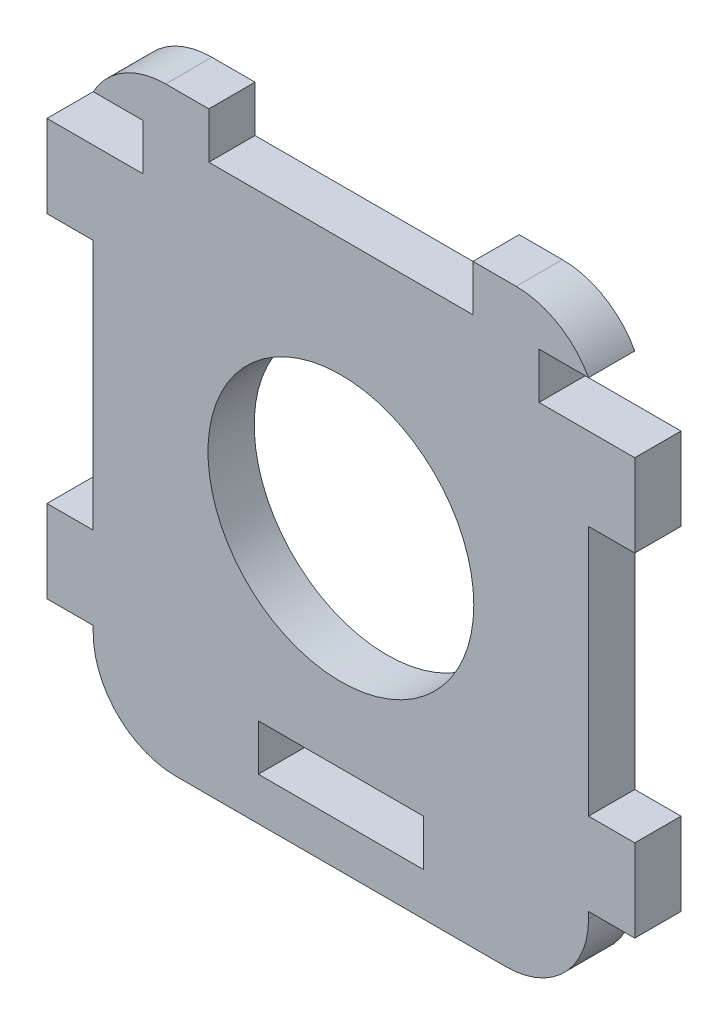
ISO-10303-21;
HEADER;
FILE_DESCRIPTION(('STEP AP214'),'2;1');
FILE_NAME('part.step','',(''),(''),'','','');
FILE_SCHEMA(('AUTOMOTIVE_DESIGN { 1 0 10303 214 1 1 1 1 }'));
ENDSEC;
DATA;
#1=APPLICATION_CONTEXT('core data for automotive mechanical design processes');
#2=APPLICATION_PROTOCOL_DEFINITION('international standard','automotive_design',2000,#1);
#3=PRODUCT_CONTEXT('',#1,'mechanical');
#4=PRODUCT('Part','Part','',(#3));
#5=PRODUCT_RELATED_PRODUCT_CATEGORY('part','',(#4));
#6=PRODUCT_DEFINITION_FORMATION('','',#4);
#7=PRODUCT_DEFINITION_CONTEXT('part definition',#1,'design');
#8=PRODUCT_DEFINITION('design','',#6,#7);
#9=PRODUCT_DEFINITION_SHAPE('','',#8);
#10=(LENGTH_UNIT() NAMED_UNIT(*) SI_UNIT(.MILLI.,.METRE.));
#11=(NAMED_UNIT(*) PLANE_ANGLE_UNIT() SI_UNIT($,.RADIAN.));
#12=(NAMED_UNIT(*) SI_UNIT($,.STERADIAN.) SOLID_ANGLE_UNIT());
#13=UNCERTAINTY_MEASURE_WITH_UNIT(LENGTH_MEASURE(1.E-05),#10,'distance_accuracy_value','');
#14=(GEOMETRIC_REPRESENTATION_CONTEXT(3) GLOBAL_UNCERTAINTY_ASSIGNED_CONTEXT((#13)) GLOBAL_UNIT_ASSIGNED_CONTEXT((#10,
#11,#12)) REPRESENTATION_CONTEXT('',''));
#15=CARTESIAN_POINT('',(0.,0.,0.));
#16=DIRECTION('',(0.,0.,1.));
#17=DIRECTION('',(1.,0.,0.));
#18=AXIS2_PLACEMENT_3D('',#15,#16,#17);
#19=CARTESIAN_POINT('',(0.,0.,1.4));
#20=DIRECTION('',(0.,0.,1.));
#21=DIRECTION('',(1.,0.,0.));
#22=AXIS2_PLACEMENT_3D('',#19,#20,#21);
#23=PLANE('',#22);
#24=DIRECTION('',(1.,0.,0.));
#25=VECTOR('',#24,1.);
#26=CARTESIAN_POINT('',(15.,15.4,1.4));
#27=LINE('',#26,#25);
#28=CARTESIAN_POINT('',(12.,15.4,1.4));
#29=VERTEX_POINT('',#28);
#30=CARTESIAN_POINT('',(15.,15.4,1.4));
#31=VERTEX_POINT('',#30);
#32=EDGE_CURVE('E357',#29,#31,#27,.T.);
#33=ORIENTED_EDGE('',*,*,#32,.T.);
#34=CARTESIAN_POINT('',(10.6136575601077,13.,1.4));
#35=DIRECTION('',(0.,0.,1.));
#36=DIRECTION('',(1.,0.,0.));
#37=AXIS2_PLACEMENT_3D('',#34,#35,#36);
#38=CIRCLE('',#37,5.);
#39=CARTESIAN_POINT('',(10.6136575601077,18.,1.4));
#40=VERTEX_POINT('',#39);
#41=EDGE_CURVE('E502',#31,#40,#38,.T.);
#42=ORIENTED_EDGE('',*,*,#41,.T.);
#43=DIRECTION('',(-1.,0.,0.));
#44=VECTOR('',#43,1.);
#45=CARTESIAN_POINT('',(8.,18.,1.4));
#46=LINE('',#45,#44);
#47=CARTESIAN_POINT('',(8.,18.,1.4));
#48=VERTEX_POINT('',#47);
#49=EDGE_CURVE('E304',#40,#48,#46,.T.);
#50=ORIENTED_EDGE('',*,*,#49,.T.);
#51=DIRECTION('',(0.,-1.,0.));
#52=VECTOR('',#51,1.);
#53=CARTESIAN_POINT('',(8.,15.2,1.4));
#54=LINE('',#53,#52);
#55=CARTESIAN_POINT('',(8.,15.2,1.4));
#56=VERTEX_POINT('',#55);
#57=EDGE_CURVE('E306',#48,#56,#54,.T.);
#58=ORIENTED_EDGE('',*,*,#57,.T.);
#59=DIRECTION('',(-1.,0.,0.));
#60=VECTOR('',#59,1.);
#61=CARTESIAN_POINT('',(-8.,15.2,1.4));
#62=LINE('',#61,#60);
#63=CARTESIAN_POINT('',(-8.,15.2,1.4));
#64=VERTEX_POINT('',#63);
#65=EDGE_CURVE('E309',#56,#64,#62,.T.);
#66=ORIENTED_EDGE('',*,*,#65,.T.);
#67=DIRECTION('',(0.,1.,0.));
#68=VECTOR('',#67,1.);
#69=CARTESIAN_POINT('',(-8.,15.2,1.4));
#70=LINE('',#69,#68);
#71=CARTESIAN_POINT('',(-8.,18.,1.4));
#72=VERTEX_POINT('',#71);
#73=EDGE_CURVE('E311',#64,#72,#70,.T.);
#74=ORIENTED_EDGE('',*,*,#73,.T.);
#75=DIRECTION('',(-1.,0.,0.));
#76=VECTOR('',#75,1.);
#77=CARTESIAN_POINT('',(-15.,18.,1.4));
#78=LINE('',#77,#76);
#79=CARTESIAN_POINT('',(-10.6136575601077,18.,1.4));
#80=VERTEX_POINT('',#79);
#81=EDGE_CURVE('E313',#72,#80,#78,.T.);
#82=ORIENTED_EDGE('',*,*,#81,.T.);
#83=CARTESIAN_POINT('',(-10.6136575601077,13.,1.4));
#84=DIRECTION('',(0.,0.,1.));
#85=DIRECTION('',(1.,0.,0.));
#86=AXIS2_PLACEMENT_3D('',#83,#84,#85);
#87=CIRCLE('',#86,5.);
#88=CARTESIAN_POINT('',(-15.,15.4,1.4));
#89=VERTEX_POINT('',#88);
#90=EDGE_CURVE('E500',#80,#89,#87,.T.);
#91=ORIENTED_EDGE('',*,*,#90,.T.);
#92=DIRECTION('',(1.,0.,0.));
#93=VECTOR('',#92,1.);
#94=CARTESIAN_POINT('',(-15.,15.4,1.4));
#95=LINE('',#94,#93);
#96=CARTESIAN_POINT('',(-12.,15.4,1.4));
#97=VERTEX_POINT('',#96);
#98=EDGE_CURVE('E316',#89,#97,#95,.T.);
#99=ORIENTED_EDGE('',*,*,#98,.T.);
#100=DIRECTION('',(0.,-1.,0.));
#101=VECTOR('',#100,1.);
#102=CARTESIAN_POINT('',(-12.,12.6,1.4));
#103=LINE('',#102,#101);
#104=CARTESIAN_POINT('',(-12.,12.6,1.4));
#105=VERTEX_POINT('',#104);
#106=EDGE_CURVE('E318',#97,#105,#103,.T.);
#107=ORIENTED_EDGE('',*,*,#106,.T.);
#108=DIRECTION('',(-1.,0.,0.));
#109=VECTOR('',#108,1.);
#110=CARTESIAN_POINT('',(-15.,12.6,1.4));
#111=LINE('',#110,#109);
#112=CARTESIAN_POINT('',(-17.8,12.6,1.4));
#113=VERTEX_POINT('',#112);
#114=EDGE_CURVE('E320',#105,#113,#111,.T.);
#115=ORIENTED_EDGE('',*,*,#114,.T.);
#116=DIRECTION('',(0.,-1.,0.));
#117=VECTOR('',#116,1.);
#118=CARTESIAN_POINT('',(-17.8,12.6,1.4));
#119=LINE('',#118,#117);
#120=CARTESIAN_POINT('',(-17.8,7.59999999999999,1.4));
#121=VERTEX_POINT('',#120);
#122=EDGE_CURVE('E322',#113,#121,#119,.T.);
#123=ORIENTED_EDGE('',*,*,#122,.T.);
#124=DIRECTION('',(1.,0.,0.));
#125=VECTOR('',#124,1.);
#126=CARTESIAN_POINT('',(-17.8,7.59999999999999,1.4));
#127=LINE('',#126,#125);
#128=CARTESIAN_POINT('',(-15.,7.59999999999999,1.4));
#129=VERTEX_POINT('',#128);
#130=EDGE_CURVE('E324',#121,#129,#127,.T.);
#131=ORIENTED_EDGE('',*,*,#130,.T.);
#132=DIRECTION('',(0.,-1.,0.));
#133=VECTOR('',#132,1.);
#134=CARTESIAN_POINT('',(-15.,-7.6,1.4));
#135=LINE('',#134,#133);
#136=CARTESIAN_POINT('',(-15.,-7.6,1.4));
#137=VERTEX_POINT('',#136);
#138=EDGE_CURVE('E326',#129,#137,#135,.T.);
#139=ORIENTED_EDGE('',*,*,#138,.T.);
#140=DIRECTION('',(-1.,0.,0.));
#141=VECTOR('',#140,1.);
#142=CARTESIAN_POINT('',(-17.8,-7.6,1.4));
#143=LINE('',#142,#141);
#144=CARTESIAN_POINT('',(-17.8,-7.6,1.4));
#145=VERTEX_POINT('',#144);
#146=EDGE_CURVE('E328',#137,#145,#143,.T.);
#147=ORIENTED_EDGE('',*,*,#146,.T.);
#148=DIRECTION('',(0.,-1.,0.));
#149=VECTOR('',#148,1.);
#150=CARTESIAN_POINT('',(-17.8,-12.6,1.4));
#151=LINE('',#150,#149);
#152=CARTESIAN_POINT('',(-17.8,-12.6,1.4));
#153=VERTEX_POINT('',#152);
#154=EDGE_CURVE('E330',#145,#153,#151,.T.);
#155=ORIENTED_EDGE('',*,*,#154,.T.);
#156=DIRECTION('',(1.,0.,0.));
#157=VECTOR('',#156,1.);
#158=CARTESIAN_POINT('',(-15.,-12.6,1.4));
#159=LINE('',#158,#157);
#160=CARTESIAN_POINT('',(-15.,-12.6,1.4));
#161=VERTEX_POINT('',#160);
#162=EDGE_CURVE('E332',#153,#161,#159,.T.);
#163=ORIENTED_EDGE('',*,*,#162,.T.);
#164=DIRECTION('',(0.,-1.,0.));
#165=VECTOR('',#164,1.);
#166=CARTESIAN_POINT('',(-15.,-18.,1.4));
#167=LINE('',#166,#165);
#168=CARTESIAN_POINT('',(-15.,-13.,1.4));
#169=VERTEX_POINT('',#168);
#170=EDGE_CURVE('E334',#161,#169,#167,.T.);
#171=ORIENTED_EDGE('',*,*,#170,.T.);
#172=CARTESIAN_POINT('',(-10.,-13.,1.4));
#173=DIRECTION('',(0.,0.,1.));
#174=DIRECTION('',(1.,0.,0.));
#175=AXIS2_PLACEMENT_3D('',#172,#173,#174);
#176=CIRCLE('',#175,5.);
#177=CARTESIAN_POINT('',(-10.,-18.,1.4));
#178=VERTEX_POINT('',#177);
#179=EDGE_CURVE('E497',#169,#178,#176,.T.);
#180=ORIENTED_EDGE('',*,*,#179,.T.);
#181=DIRECTION('',(1.,0.,0.));
#182=VECTOR('',#181,1.);
#183=CARTESIAN_POINT('',(-15.,-18.,1.4));
#184=LINE('',#183,#182);
#185=CARTESIAN_POINT('',(10.,-18.,1.4));
#186=VERTEX_POINT('',#185);
#187=EDGE_CURVE('E337',#178,#186,#184,.T.);
#188=ORIENTED_EDGE('',*,*,#187,.T.);
#189=CARTESIAN_POINT('',(10.,-13.,1.4));
#190=DIRECTION('',(0.,0.,1.));
#191=DIRECTION('',(1.,0.,0.));
#192=AXIS2_PLACEMENT_3D('',#189,#190,#191);
#193=CIRCLE('',#192,5.);
#194=CARTESIAN_POINT('',(15.,-13.,1.4));
#195=VERTEX_POINT('',#194);
#196=EDGE_CURVE('E50',#186,#195,#193,.T.);
#197=ORIENTED_EDGE('',*,*,#196,.T.);
#198=DIRECTION('',(0.,1.,0.));
#199=VECTOR('',#198,1.);
#200=CARTESIAN_POINT('',(15.,-18.,1.4));
#201=LINE('',#200,#199);
#202=CARTESIAN_POINT('',(15.,-12.6,1.4));
#203=VERTEX_POINT('',#202);
#204=EDGE_CURVE('E339',#195,#203,#201,.T.);
#205=ORIENTED_EDGE('',*,*,#204,.T.);
#206=DIRECTION('',(1.,0.,0.));
#207=VECTOR('',#206,1.);
#208=CARTESIAN_POINT('',(15.,-12.6,1.4));
#209=LINE('',#208,#207);
#210=CARTESIAN_POINT('',(17.8,-12.6,1.4));
#211=VERTEX_POINT('',#210);
#212=EDGE_CURVE('E341',#203,#211,#209,.T.);
#213=ORIENTED_EDGE('',*,*,#212,.T.);
#214=DIRECTION('',(0.,1.,0.));
#215=VECTOR('',#214,1.);
#216=CARTESIAN_POINT('',(17.8,-12.6,1.4));
#217=LINE('',#216,#215);
#218=CARTESIAN_POINT('',(17.8,-7.6,1.4));
#219=VERTEX_POINT('',#218);
#220=EDGE_CURVE('E343',#211,#219,#217,.T.);
#221=ORIENTED_EDGE('',*,*,#220,.T.);
#222=DIRECTION('',(-1.,0.,0.));
#223=VECTOR('',#222,1.);
#224=CARTESIAN_POINT('',(17.8,-7.6,1.4));
#225=LINE('',#224,#223);
#226=CARTESIAN_POINT('',(15.,-7.6,1.4));
#227=VERTEX_POINT('',#226);
#228=EDGE_CURVE('E345',#219,#227,#225,.T.);
#229=ORIENTED_EDGE('',*,*,#228,.T.);
#230=DIRECTION('',(0.,1.,0.));
#231=VECTOR('',#230,1.);
#232=CARTESIAN_POINT('',(15.,-7.6,1.4));
#233=LINE('',#232,#231);
#234=CARTESIAN_POINT('',(15.,7.6,1.4));
#235=VERTEX_POINT('',#234);
#236=EDGE_CURVE('E347',#227,#235,#233,.T.);
#237=ORIENTED_EDGE('',*,*,#236,.T.);
#238=DIRECTION('',(1.,0.,0.));
#239=VECTOR('',#238,1.);
#240=CARTESIAN_POINT('',(17.8,7.6,1.4));
#241=LINE('',#240,#239);
#242=CARTESIAN_POINT('',(17.8,7.6,1.4));
#243=VERTEX_POINT('',#242);
#244=EDGE_CURVE('E349',#235,#243,#241,.T.);
#245=ORIENTED_EDGE('',*,*,#244,.T.);
#246=DIRECTION('',(0.,1.,0.));
#247=VECTOR('',#246,1.);
#248=CARTESIAN_POINT('',(17.8,12.6,1.4));
#249=LINE('',#248,#247);
#250=CARTESIAN_POINT('',(17.8,12.6,1.4));
#251=VERTEX_POINT('',#250);
#252=EDGE_CURVE('E351',#243,#251,#249,.T.);
#253=ORIENTED_EDGE('',*,*,#252,.T.);
#254=DIRECTION('',(-1.,0.,0.));
#255=VECTOR('',#254,1.);
#256=CARTESIAN_POINT('',(15.,12.6,1.4));
#257=LINE('',#256,#255);
#258=CARTESIAN_POINT('',(12.,12.6,1.4));
#259=VERTEX_POINT('',#258);
#260=EDGE_CURVE('E353',#251,#259,#257,.T.);
#261=ORIENTED_EDGE('',*,*,#260,.T.);
#262=DIRECTION('',(0.,1.,0.));
#263=VECTOR('',#262,1.);
#264=CARTESIAN_POINT('',(12.,12.6,1.4));
#265=LINE('',#264,#263);
#266=EDGE_CURVE('E355',#259,#29,#265,.T.);
#267=ORIENTED_EDGE('',*,*,#266,.T.);
#268=EDGE_LOOP('',(#33,#42,#50,#58,#66,#74,#82,#91,#99,#107,#115,#123,#131,#139,#147,#155,#163,
#171,#180,#188,#197,#205,#213,#221,#229,#237,#245,#253,#261,#267));
#269=FACE_BOUND('',#268,.T.);
#270=CARTESIAN_POINT('',(0.,0.,1.4));
#271=DIRECTION('',(0.,0.,1.));
#272=DIRECTION('',(1.,0.,0.));
#273=AXIS2_PLACEMENT_3D('',#270,#271,#272);
#274=CIRCLE('',#273,8.05);
#275=CARTESIAN_POINT('',(8.05,0.,1.4));
#276=VERTEX_POINT('',#275);
#277=EDGE_CURVE('E298',#276,#276,#274,.T.);
#278=ORIENTED_EDGE('',*,*,#277,.F.);
#279=EDGE_LOOP('',(#278));
#280=FACE_BOUND('',#279,.T.);
#281=DIRECTION('',(-1.,0.,0.));
#282=VECTOR('',#281,1.);
#283=CARTESIAN_POINT('',(5.,-12.6,1.4));
#284=LINE('',#283,#282);
#285=CARTESIAN_POINT('',(5.,-12.6,1.4));
#286=VERTEX_POINT('',#285);
#287=CARTESIAN_POINT('',(-5.,-12.6,1.4));
#288=VERTEX_POINT('',#287);
#289=EDGE_CURVE('E267',#286,#288,#284,.T.);
#290=ORIENTED_EDGE('',*,*,#289,.F.);
#291=DIRECTION('',(0.,1.,0.));
#292=VECTOR('',#291,1.);
#293=CARTESIAN_POINT('',(5.,-12.6,1.4));
#294=LINE('',#293,#292);
#295=CARTESIAN_POINT('',(5.,-15.4,1.4));
#296=VERTEX_POINT('',#295);
#297=EDGE_CURVE('E257',#296,#286,#294,.T.);
#298=ORIENTED_EDGE('',*,*,#297,.F.);
#299=DIRECTION('',(1.,0.,0.));
#300=VECTOR('',#299,1.);
#301=CARTESIAN_POINT('',(5.,-15.4,1.4));
#302=LINE('',#301,#300);
#303=CARTESIAN_POINT('',(-5.,-15.4,1.4));
#304=VERTEX_POINT('',#303);
#305=EDGE_CURVE('E282',#304,#296,#302,.T.);
#306=ORIENTED_EDGE('',*,*,#305,.F.);
#307=DIRECTION('',(0.,-1.,0.));
#308=VECTOR('',#307,1.);
#309=CARTESIAN_POINT('',(-5.,-12.6,1.4));
#310=LINE('',#309,#308);
#311=EDGE_CURVE('E280',#288,#304,#310,.T.);
#312=ORIENTED_EDGE('',*,*,#311,.F.);
#313=EDGE_LOOP('',(#290,#298,#306,#312));
#314=FACE_BOUND('',#313,.T.);
#315=ADVANCED_FACE('F35',(#269,#280,#314),#23,.T.);
#316=CARTESIAN_POINT('',(0.,0.,-1.4));
#317=DIRECTION('',(0.,0.,1.));
#318=DIRECTION('',(1.,0.,0.));
#319=AXIS2_PLACEMENT_3D('',#316,#317,#318);
#320=PLANE('',#319);
#321=CARTESIAN_POINT('',(0.,0.,-1.4));
#322=DIRECTION('',(0.,0.,1.));
#323=DIRECTION('',(1.,0.,0.));
#324=AXIS2_PLACEMENT_3D('',#321,#322,#323);
#325=CIRCLE('',#324,8.05);
#326=CARTESIAN_POINT('',(8.05,0.,-1.4));
#327=VERTEX_POINT('',#326);
#328=EDGE_CURVE('E275',#327,#327,#325,.T.);
#329=ORIENTED_EDGE('',*,*,#328,.T.);
#330=EDGE_LOOP('',(#329));
#331=FACE_BOUND('',#330,.T.);
#332=DIRECTION('',(-1.,0.,0.));
#333=VECTOR('',#332,1.);
#334=CARTESIAN_POINT('',(8.,18.,-1.4));
#335=LINE('',#334,#333);
#336=CARTESIAN_POINT('',(10.6136575601077,18.,-1.4));
#337=VERTEX_POINT('',#336);
#338=CARTESIAN_POINT('',(8.,18.,-1.4));
#339=VERTEX_POINT('',#338);
#340=EDGE_CURVE('E301',#337,#339,#335,.T.);
#341=ORIENTED_EDGE('',*,*,#340,.F.);
#342=CARTESIAN_POINT('',(10.6136575601077,13.,-1.4));
#343=DIRECTION('',(0.,0.,1.));
#344=DIRECTION('',(1.,0.,0.));
#345=AXIS2_PLACEMENT_3D('',#342,#343,#344);
#346=CIRCLE('',#345,5.);
#347=CARTESIAN_POINT('',(15.,15.4,-1.4));
#348=VERTEX_POINT('',#347);
#349=EDGE_CURVE('E495',#337,#348,#346,.F.);
#350=ORIENTED_EDGE('',*,*,#349,.T.);
#351=DIRECTION('',(1.,0.,0.));
#352=VECTOR('',#351,1.);
#353=CARTESIAN_POINT('',(15.,15.4,-1.4));
#354=LINE('',#353,#352);
#355=CARTESIAN_POINT('',(12.,15.4,-1.4));
#356=VERTEX_POINT('',#355);
#357=EDGE_CURVE('E307',#356,#348,#354,.T.);
#358=ORIENTED_EDGE('',*,*,#357,.F.);
#359=DIRECTION('',(0.,1.,0.));
#360=VECTOR('',#359,1.);
#361=CARTESIAN_POINT('',(12.,12.6,-1.4));
#362=LINE('',#361,#360);
#363=CARTESIAN_POINT('',(12.,12.6,-1.4));
#364=VERTEX_POINT('',#363);
#365=EDGE_CURVE('E411',#364,#356,#362,.T.);
#366=ORIENTED_EDGE('',*,*,#365,.F.);
#367=DIRECTION('',(-1.,0.,0.));
#368=VECTOR('',#367,1.);
#369=CARTESIAN_POINT('',(15.,12.6,-1.4));
#370=LINE('',#369,#368);
#371=CARTESIAN_POINT('',(17.8,12.6,-1.4));
#372=VERTEX_POINT('',#371);
#373=EDGE_CURVE('E409',#372,#364,#370,.T.);
#374=ORIENTED_EDGE('',*,*,#373,.F.);
#375=DIRECTION('',(0.,1.,0.));
#376=VECTOR('',#375,1.);
#377=CARTESIAN_POINT('',(17.8,12.6,-1.4));
#378=LINE('',#377,#376);
#379=CARTESIAN_POINT('',(17.8,7.6,-1.4));
#380=VERTEX_POINT('',#379);
#381=EDGE_CURVE('E406',#380,#372,#378,.T.);
#382=ORIENTED_EDGE('',*,*,#381,.F.);
#383=DIRECTION('',(1.,0.,0.));
#384=VECTOR('',#383,1.);
#385=CARTESIAN_POINT('',(17.8,7.6,-1.4));
#386=LINE('',#385,#384);
#387=CARTESIAN_POINT('',(15.,7.6,-1.4));
#388=VERTEX_POINT('',#387);
#389=EDGE_CURVE('E404',#388,#380,#386,.T.);
#390=ORIENTED_EDGE('',*,*,#389,.F.);
#391=DIRECTION('',(0.,1.,0.));
#392=VECTOR('',#391,1.);
#393=CARTESIAN_POINT('',(15.,-7.6,-1.4));
#394=LINE('',#393,#392);
#395=CARTESIAN_POINT('',(15.,-7.6,-1.4));
#396=VERTEX_POINT('',#395);
#397=EDGE_CURVE('E402',#396,#388,#394,.T.);
#398=ORIENTED_EDGE('',*,*,#397,.F.);
#399=DIRECTION('',(-1.,0.,0.));
#400=VECTOR('',#399,1.);
#401=CARTESIAN_POINT('',(17.8,-7.6,-1.4));
#402=LINE('',#401,#400);
#403=CARTESIAN_POINT('',(17.8,-7.6,-1.4));
#404=VERTEX_POINT('',#403);
#405=EDGE_CURVE('E400',#404,#396,#402,.T.);
#406=ORIENTED_EDGE('',*,*,#405,.F.);
#407=DIRECTION('',(0.,1.,0.));
#408=VECTOR('',#407,1.);
#409=CARTESIAN_POINT('',(17.8,-12.6,-1.4));
#410=LINE('',#409,#408);
#411=CARTESIAN_POINT('',(17.8,-12.6,-1.4));
#412=VERTEX_POINT('',#411);
#413=EDGE_CURVE('E398',#412,#404,#410,.T.);
#414=ORIENTED_EDGE('',*,*,#413,.F.);
#415=DIRECTION('',(1.,0.,0.));
#416=VECTOR('',#415,1.);
#417=CARTESIAN_POINT('',(15.,-12.6,-1.4));
#418=LINE('',#417,#416);
#419=CARTESIAN_POINT('',(15.,-12.6,-1.4));
#420=VERTEX_POINT('',#419);
#421=EDGE_CURVE('E396',#420,#412,#418,.T.);
#422=ORIENTED_EDGE('',*,*,#421,.F.);
#423=DIRECTION('',(0.,1.,0.));
#424=VECTOR('',#423,1.);
#425=CARTESIAN_POINT('',(15.,-18.,-1.4));
#426=LINE('',#425,#424);
#427=CARTESIAN_POINT('',(15.,-13.,-1.4));
#428=VERTEX_POINT('',#427);
#429=EDGE_CURVE('E394',#428,#420,#426,.T.);
#430=ORIENTED_EDGE('',*,*,#429,.F.);
#431=CARTESIAN_POINT('',(10.,-13.,-1.4));
#432=DIRECTION('',(0.,0.,1.));
#433=DIRECTION('',(1.,0.,0.));
#434=AXIS2_PLACEMENT_3D('',#431,#432,#433);
#435=CIRCLE('',#434,5.);
#436=CARTESIAN_POINT('',(10.,-18.,-1.4));
#437=VERTEX_POINT('',#436);
#438=EDGE_CURVE('E491',#428,#437,#435,.F.);
#439=ORIENTED_EDGE('',*,*,#438,.T.);
#440=DIRECTION('',(1.,0.,0.));
#441=VECTOR('',#440,1.);
#442=CARTESIAN_POINT('',(-15.,-18.,-1.4));
#443=LINE('',#442,#441);
#444=CARTESIAN_POINT('',(-10.,-18.,-1.4));
#445=VERTEX_POINT('',#444);
#446=EDGE_CURVE('E392',#445,#437,#443,.T.);
#447=ORIENTED_EDGE('',*,*,#446,.F.);
#448=CARTESIAN_POINT('',(-10.,-13.,-1.4));
#449=DIRECTION('',(0.,0.,1.));
#450=DIRECTION('',(1.,0.,0.));
#451=AXIS2_PLACEMENT_3D('',#448,#449,#450);
#452=CIRCLE('',#451,5.);
#453=CARTESIAN_POINT('',(-15.,-13.,-1.4));
#454=VERTEX_POINT('',#453);
#455=EDGE_CURVE('E489',#445,#454,#452,.F.);
#456=ORIENTED_EDGE('',*,*,#455,.T.);
#457=DIRECTION('',(0.,-1.,0.));
#458=VECTOR('',#457,1.);
#459=CARTESIAN_POINT('',(-15.,-18.,-1.4));
#460=LINE('',#459,#458);
#461=CARTESIAN_POINT('',(-15.,-12.6,-1.4));
#462=VERTEX_POINT('',#461);
#463=EDGE_CURVE('E389',#462,#454,#460,.T.);
#464=ORIENTED_EDGE('',*,*,#463,.F.);
#465=DIRECTION('',(1.,0.,0.));
#466=VECTOR('',#465,1.);
#467=CARTESIAN_POINT('',(-15.,-12.6,-1.4));
#468=LINE('',#467,#466);
#469=CARTESIAN_POINT('',(-17.8,-12.6,-1.4));
#470=VERTEX_POINT('',#469);
#471=EDGE_CURVE('E387',#470,#462,#468,.T.);
#472=ORIENTED_EDGE('',*,*,#471,.F.);
#473=DIRECTION('',(0.,-1.,0.));
#474=VECTOR('',#473,1.);
#475=CARTESIAN_POINT('',(-17.8,-12.6,-1.4));
#476=LINE('',#475,#474);
#477=CARTESIAN_POINT('',(-17.8,-7.6,-1.4));
#478=VERTEX_POINT('',#477);
#479=EDGE_CURVE('E385',#478,#470,#476,.T.);
#480=ORIENTED_EDGE('',*,*,#479,.F.);
#481=DIRECTION('',(-1.,0.,0.));
#482=VECTOR('',#481,1.);
#483=CARTESIAN_POINT('',(-17.8,-7.6,-1.4));
#484=LINE('',#483,#482);
#485=CARTESIAN_POINT('',(-15.,-7.6,-1.4));
#486=VERTEX_POINT('',#485);
#487=EDGE_CURVE('E383',#486,#478,#484,.T.);
#488=ORIENTED_EDGE('',*,*,#487,.F.);
#489=DIRECTION('',(0.,-1.,0.));
#490=VECTOR('',#489,1.);
#491=CARTESIAN_POINT('',(-15.,-7.6,-1.4));
#492=LINE('',#491,#490);
#493=CARTESIAN_POINT('',(-15.,7.59999999999999,-1.4));
#494=VERTEX_POINT('',#493);
#495=EDGE_CURVE('E381',#494,#486,#492,.T.);
#496=ORIENTED_EDGE('',*,*,#495,.F.);
#497=DIRECTION('',(1.,0.,0.));
#498=VECTOR('',#497,1.);
#499=CARTESIAN_POINT('',(-17.8,7.59999999999999,-1.4));
#500=LINE('',#499,#498);
#501=CARTESIAN_POINT('',(-17.8,7.59999999999999,-1.4));
#502=VERTEX_POINT('',#501);
#503=EDGE_CURVE('E379',#502,#494,#500,.T.);
#504=ORIENTED_EDGE('',*,*,#503,.F.);
#505=DIRECTION('',(0.,-1.,0.));
#506=VECTOR('',#505,1.);
#507=CARTESIAN_POINT('',(-17.8,12.6,-1.4));
#508=LINE('',#507,#506);
#509=CARTESIAN_POINT('',(-17.8,12.6,-1.4));
#510=VERTEX_POINT('',#509);
#511=EDGE_CURVE('E377',#510,#502,#508,.T.);
#512=ORIENTED_EDGE('',*,*,#511,.F.);
#513=DIRECTION('',(-1.,0.,0.));
#514=VECTOR('',#513,1.);
#515=CARTESIAN_POINT('',(-15.,12.6,-1.4));
#516=LINE('',#515,#514);
#517=CARTESIAN_POINT('',(-12.,12.6,-1.4));
#518=VERTEX_POINT('',#517);
#519=EDGE_CURVE('E375',#518,#510,#516,.T.);
#520=ORIENTED_EDGE('',*,*,#519,.F.);
#521=DIRECTION('',(0.,-1.,0.));
#522=VECTOR('',#521,1.);
#523=CARTESIAN_POINT('',(-12.,12.6,-1.4));
#524=LINE('',#523,#522);
#525=CARTESIAN_POINT('',(-12.,15.4,-1.4));
#526=VERTEX_POINT('',#525);
#527=EDGE_CURVE('E372',#526,#518,#524,.T.);
#528=ORIENTED_EDGE('',*,*,#527,.F.);
#529=DIRECTION('',(1.,0.,0.));
#530=VECTOR('',#529,1.);
#531=CARTESIAN_POINT('',(-15.,15.4,-1.4));
#532=LINE('',#531,#530);
#533=CARTESIAN_POINT('',(-15.,15.4,-1.4));
#534=VERTEX_POINT('',#533);
#535=EDGE_CURVE('E370',#534,#526,#532,.T.);
#536=ORIENTED_EDGE('',*,*,#535,.F.);
#537=CARTESIAN_POINT('',(-10.6136575601077,13.,-1.4));
#538=DIRECTION('',(0.,0.,1.));
#539=DIRECTION('',(1.,0.,0.));
#540=AXIS2_PLACEMENT_3D('',#537,#538,#539);
#541=CIRCLE('',#540,5.);
#542=CARTESIAN_POINT('',(-10.6136575601077,18.,-1.4));
#543=VERTEX_POINT('',#542);
#544=EDGE_CURVE('E493',#534,#543,#541,.F.);
#545=ORIENTED_EDGE('',*,*,#544,.T.);
#546=DIRECTION('',(-1.,0.,0.));
#547=VECTOR('',#546,1.);
#548=CARTESIAN_POINT('',(-15.,18.,-1.4));
#549=LINE('',#548,#547);
#550=CARTESIAN_POINT('',(-8.,18.,-1.4));
#551=VERTEX_POINT('',#550);
#552=EDGE_CURVE('E367',#551,#543,#549,.T.);
#553=ORIENTED_EDGE('',*,*,#552,.F.);
#554=DIRECTION('',(0.,1.,0.));
#555=VECTOR('',#554,1.);
#556=CARTESIAN_POINT('',(-8.,15.2,-1.4));
#557=LINE('',#556,#555);
#558=CARTESIAN_POINT('',(-8.,15.2,-1.4));
#559=VERTEX_POINT('',#558);
#560=EDGE_CURVE('E365',#559,#551,#557,.T.);
#561=ORIENTED_EDGE('',*,*,#560,.F.);
#562=DIRECTION('',(-1.,0.,0.));
#563=VECTOR('',#562,1.);
#564=CARTESIAN_POINT('',(-8.,15.2,-1.4));
#565=LINE('',#564,#563);
#566=CARTESIAN_POINT('',(8.,15.2,-1.4));
#567=VERTEX_POINT('',#566);
#568=EDGE_CURVE('E363',#567,#559,#565,.T.);
#569=ORIENTED_EDGE('',*,*,#568,.F.);
#570=DIRECTION('',(0.,-1.,0.));
#571=VECTOR('',#570,1.);
#572=CARTESIAN_POINT('',(8.,15.2,-1.4));
#573=LINE('',#572,#571);
#574=EDGE_CURVE('E361',#339,#567,#573,.T.);
#575=ORIENTED_EDGE('',*,*,#574,.F.);
#576=EDGE_LOOP('',(#341,#350,#358,#366,#374,#382,#390,#398,#406,#414,#422,#430,#439,#447,#456,
#464,#472,#480,#488,#496,#504,#512,#520,#528,#536,#545,#553,#561,#569,#575));
#577=FACE_BOUND('',#576,.T.);
#578=DIRECTION('',(0.,1.,0.));
#579=VECTOR('',#578,1.);
#580=CARTESIAN_POINT('',(5.,-12.6,-1.4));
#581=LINE('',#580,#579);
#582=CARTESIAN_POINT('',(5.,-15.4,-1.4));
#583=VERTEX_POINT('',#582);
#584=CARTESIAN_POINT('',(5.,-12.6,-1.4));
#585=VERTEX_POINT('',#584);
#586=EDGE_CURVE('E286',#583,#585,#581,.T.);
#587=ORIENTED_EDGE('',*,*,#586,.T.);
#588=DIRECTION('',(-1.,0.,0.));
#589=VECTOR('',#588,1.);
#590=CARTESIAN_POINT('',(5.,-12.6,-1.4));
#591=LINE('',#590,#589);
#592=CARTESIAN_POINT('',(-5.,-12.6,-1.4));
#593=VERTEX_POINT('',#592);
#594=EDGE_CURVE('E274',#585,#593,#591,.T.);
#595=ORIENTED_EDGE('',*,*,#594,.T.);
#596=DIRECTION('',(0.,-1.,0.));
#597=VECTOR('',#596,1.);
#598=CARTESIAN_POINT('',(-5.,-12.6,-1.4));
#599=LINE('',#598,#597);
#600=CARTESIAN_POINT('',(-5.,-15.4,-1.4));
#601=VERTEX_POINT('',#600);
#602=EDGE_CURVE('E289',#593,#601,#599,.T.);
#603=ORIENTED_EDGE('',*,*,#602,.T.);
#604=DIRECTION('',(1.,0.,0.));
#605=VECTOR('',#604,1.);
#606=CARTESIAN_POINT('',(5.,-15.4,-1.4));
#607=LINE('',#606,#605);
#608=EDGE_CURVE('E268',#601,#583,#607,.T.);
#609=ORIENTED_EDGE('',*,*,#608,.T.);
#610=EDGE_LOOP('',(#587,#595,#603,#609));
#611=FACE_BOUND('',#610,.T.);
#612=ADVANCED_FACE('F518',(#331,#577,#611),#320,.F.);
#613=CARTESIAN_POINT('',(8.,18.,1.4));
#614=DIRECTION('',(0.,-1.,0.));
#615=DIRECTION('',(1.,0.,0.));
#616=AXIS2_PLACEMENT_3D('',#613,#614,#615);
#617=PLANE('',#616);
#618=ORIENTED_EDGE('',*,*,#49,.F.);
#619=DIRECTION('',(0.,0.,-1.));
#620=VECTOR('',#619,1.);
#621=CARTESIAN_POINT('',(10.6136575601077,18.,1.4));
#622=LINE('',#621,#620);
#623=EDGE_CURVE('E486',#40,#337,#622,.T.);
#624=ORIENTED_EDGE('',*,*,#623,.T.);
#625=ORIENTED_EDGE('',*,*,#340,.T.);
#626=DIRECTION('',(0.,0.,-1.));
#627=VECTOR('',#626,1.);
#628=CARTESIAN_POINT('',(8.,18.,1.4));
#629=LINE('',#628,#627);
#630=EDGE_CURVE('E483',#48,#339,#629,.T.);
#631=ORIENTED_EDGE('',*,*,#630,.F.);
#632=EDGE_LOOP('',(#618,#624,#625,#631));
#633=FACE_BOUND('',#632,.T.);
#634=ADVANCED_FACE('F580',(#633),#617,.F.);
#635=CARTESIAN_POINT('',(8.,15.2,1.4));
#636=DIRECTION('',(1.,0.,0.));
#637=DIRECTION('',(0.,0.,-1.));
#638=AXIS2_PLACEMENT_3D('',#635,#636,#637);
#639=PLANE('',#638);
#640=ORIENTED_EDGE('',*,*,#574,.T.);
#641=DIRECTION('',(0.,0.,-1.));
#642=VECTOR('',#641,1.);
#643=CARTESIAN_POINT('',(8.,15.2,1.4));
#644=LINE('',#643,#642);
#645=EDGE_CURVE('E480',#56,#567,#644,.T.);
#646=ORIENTED_EDGE('',*,*,#645,.F.);
#647=ORIENTED_EDGE('',*,*,#57,.F.);
#648=ORIENTED_EDGE('',*,*,#630,.T.);
#649=EDGE_LOOP('',(#640,#646,#647,#648));
#650=FACE_BOUND('',#649,.T.);
#651=ADVANCED_FACE('F587',(#650),#639,.F.);
#652=CARTESIAN_POINT('',(-8.,15.2,1.4));
#653=DIRECTION('',(0.,-1.,0.));
#654=DIRECTION('',(0.,0.,-1.));
#655=AXIS2_PLACEMENT_3D('',#652,#653,#654);
#656=PLANE('',#655);
#657=ORIENTED_EDGE('',*,*,#568,.T.);
#658=DIRECTION('',(0.,0.,-1.));
#659=VECTOR('',#658,1.);
#660=CARTESIAN_POINT('',(-8.,15.2,1.4));
#661=LINE('',#660,#659);
#662=EDGE_CURVE('E477',#64,#559,#661,.T.);
#663=ORIENTED_EDGE('',*,*,#662,.F.);
#664=ORIENTED_EDGE('',*,*,#65,.F.);
#665=ORIENTED_EDGE('',*,*,#645,.T.);
#666=EDGE_LOOP('',(#657,#663,#664,#665));
#667=FACE_BOUND('',#666,.T.);
#668=ADVANCED_FACE('F593',(#667),#656,.F.);
#669=CARTESIAN_POINT('',(-8.,15.2,1.4));
#670=DIRECTION('',(-1.,0.,0.));
#671=DIRECTION('',(0.,0.,1.));
#672=AXIS2_PLACEMENT_3D('',#669,#670,#671);
#673=PLANE('',#672);
#674=ORIENTED_EDGE('',*,*,#560,.T.);
#675=DIRECTION('',(0.,0.,-1.));
#676=VECTOR('',#675,1.);
#677=CARTESIAN_POINT('',(-8.,18.,1.4));
#678=LINE('',#677,#676);
#679=EDGE_CURVE('E474',#72,#551,#678,.T.);
#680=ORIENTED_EDGE('',*,*,#679,.F.);
#681=ORIENTED_EDGE('',*,*,#73,.F.);
#682=ORIENTED_EDGE('',*,*,#662,.T.);
#683=EDGE_LOOP('',(#674,#680,#681,#682));
#684=FACE_BOUND('',#683,.T.);
#685=ADVANCED_FACE('F595',(#684),#673,.F.);
#686=CARTESIAN_POINT('',(-15.,18.,1.4));
#687=DIRECTION('',(0.,-1.,0.));
#688=DIRECTION('',(0.,0.,-1.));
#689=AXIS2_PLACEMENT_3D('',#686,#687,#688);
#690=PLANE('',#689);
#691=ORIENTED_EDGE('',*,*,#552,.T.);
#692=DIRECTION('',(0.,0.,1.));
#693=VECTOR('',#692,1.);
#694=CARTESIAN_POINT('',(-10.6136575601077,18.,1.4));
#695=LINE('',#694,#693);
#696=EDGE_CURVE('E504',#543,#80,#695,.T.);
#697=ORIENTED_EDGE('',*,*,#696,.T.);
#698=ORIENTED_EDGE('',*,*,#81,.F.);
#699=ORIENTED_EDGE('',*,*,#679,.T.);
#700=EDGE_LOOP('',(#691,#697,#698,#699));
#701=FACE_BOUND('',#700,.T.);
#702=ADVANCED_FACE('F599',(#701),#690,.F.);
#703=CARTESIAN_POINT('',(-15.,15.4,1.4));
#704=DIRECTION('',(0.,1.,0.));
#705=DIRECTION('',(0.,0.,1.));
#706=AXIS2_PLACEMENT_3D('',#703,#704,#705);
#707=PLANE('',#706);
#708=ORIENTED_EDGE('',*,*,#535,.T.);
#709=DIRECTION('',(0.,0.,-1.));
#710=VECTOR('',#709,1.);
#711=CARTESIAN_POINT('',(-12.,15.4,1.4));
#712=LINE('',#711,#710);
#713=EDGE_CURVE('E468',#97,#526,#712,.T.);
#714=ORIENTED_EDGE('',*,*,#713,.F.);
#715=ORIENTED_EDGE('',*,*,#98,.F.);
#716=DIRECTION('',(0.,0.,-1.));
#717=VECTOR('',#716,1.);
#718=CARTESIAN_POINT('',(-15.,15.4,1.4));
#719=LINE('',#718,#717);
#720=EDGE_CURVE('E471',#89,#534,#719,.T.);
#721=ORIENTED_EDGE('',*,*,#720,.T.);
#722=EDGE_LOOP('',(#708,#714,#715,#721));
#723=FACE_BOUND('',#722,.T.);
#724=ADVANCED_FACE('F608',(#723),#707,.F.);
#725=CARTESIAN_POINT('',(-12.,12.6,1.4));
#726=DIRECTION('',(1.,0.,0.));
#727=DIRECTION('',(0.,0.,-1.));
#728=AXIS2_PLACEMENT_3D('',#725,#726,#727);
#729=PLANE('',#728);
#730=ORIENTED_EDGE('',*,*,#527,.T.);
#731=DIRECTION('',(0.,0.,-1.));
#732=VECTOR('',#731,1.);
#733=CARTESIAN_POINT('',(-12.,12.6,1.4));
#734=LINE('',#733,#732);
#735=EDGE_CURVE('E465',#105,#518,#734,.T.);
#736=ORIENTED_EDGE('',*,*,#735,.F.);
#737=ORIENTED_EDGE('',*,*,#106,.F.);
#738=ORIENTED_EDGE('',*,*,#713,.T.);
#739=EDGE_LOOP('',(#730,#736,#737,#738));
#740=FACE_BOUND('',#739,.T.);
#741=ADVANCED_FACE('F614',(#740),#729,.F.);
#742=CARTESIAN_POINT('',(-15.,12.6,1.4));
#743=DIRECTION('',(0.,-1.,0.));
#744=DIRECTION('',(1.,0.,0.));
#745=AXIS2_PLACEMENT_3D('',#742,#743,#744);
#746=PLANE('',#745);
#747=ORIENTED_EDGE('',*,*,#519,.T.);
#748=DIRECTION('',(0.,0.,-1.));
#749=VECTOR('',#748,1.);
#750=CARTESIAN_POINT('',(-17.8,12.6,1.4));
#751=LINE('',#750,#749);
#752=EDGE_CURVE('E462',#113,#510,#751,.T.);
#753=ORIENTED_EDGE('',*,*,#752,.F.);
#754=ORIENTED_EDGE('',*,*,#114,.F.);
#755=ORIENTED_EDGE('',*,*,#735,.T.);
#756=EDGE_LOOP('',(#747,#753,#754,#755));
#757=FACE_BOUND('',#756,.T.);
#758=ADVANCED_FACE('F618',(#757),#746,.F.);
#759=CARTESIAN_POINT('',(-17.8,12.6,1.4));
#760=DIRECTION('',(1.,0.,0.));
#761=DIRECTION('',(0.,0.,-1.));
#762=AXIS2_PLACEMENT_3D('',#759,#760,#761);
#763=PLANE('',#762);
#764=ORIENTED_EDGE('',*,*,#511,.T.);
#765=DIRECTION('',(0.,0.,-1.));
#766=VECTOR('',#765,1.);
#767=CARTESIAN_POINT('',(-17.8,7.59999999999999,1.4));
#768=LINE('',#767,#766);
#769=EDGE_CURVE('E459',#121,#502,#768,.T.);
#770=ORIENTED_EDGE('',*,*,#769,.F.);
#771=ORIENTED_EDGE('',*,*,#122,.F.);
#772=ORIENTED_EDGE('',*,*,#752,.T.);
#773=EDGE_LOOP('',(#764,#770,#771,#772));
#774=FACE_BOUND('',#773,.T.);
#775=ADVANCED_FACE('F625',(#774),#763,.F.);
#776=CARTESIAN_POINT('',(-17.8,7.59999999999999,1.4));
#777=DIRECTION('',(0.,1.,0.));
#778=DIRECTION('',(0.,0.,1.));
#779=AXIS2_PLACEMENT_3D('',#776,#777,#778);
#780=PLANE('',#779);
#781=ORIENTED_EDGE('',*,*,#503,.T.);
#782=DIRECTION('',(0.,0.,-1.));
#783=VECTOR('',#782,1.);
#784=CARTESIAN_POINT('',(-15.,7.59999999999999,1.4));
#785=LINE('',#784,#783);
#786=EDGE_CURVE('E456',#129,#494,#785,.T.);
#787=ORIENTED_EDGE('',*,*,#786,.F.);
#788=ORIENTED_EDGE('',*,*,#130,.F.);
#789=ORIENTED_EDGE('',*,*,#769,.T.);
#790=EDGE_LOOP('',(#781,#787,#788,#789));
#791=FACE_BOUND('',#790,.T.);
#792=ADVANCED_FACE('F628',(#791),#780,.F.);
#793=CARTESIAN_POINT('',(-15.,-7.6,1.4));
#794=DIRECTION('',(1.,0.,0.));
#795=DIRECTION('',(0.,1.,0.));
#796=AXIS2_PLACEMENT_3D('',#793,#794,#795);
#797=PLANE('',#796);
#798=ORIENTED_EDGE('',*,*,#495,.T.);
#799=DIRECTION('',(0.,0.,-1.));
#800=VECTOR('',#799,1.);
#801=CARTESIAN_POINT('',(-15.,-7.6,1.4));
#802=LINE('',#801,#800);
#803=EDGE_CURVE('E453',#137,#486,#802,.T.);
#804=ORIENTED_EDGE('',*,*,#803,.F.);
#805=ORIENTED_EDGE('',*,*,#138,.F.);
#806=ORIENTED_EDGE('',*,*,#786,.T.);
#807=EDGE_LOOP('',(#798,#804,#805,#806));
#808=FACE_BOUND('',#807,.T.);
#809=ADVANCED_FACE('F633',(#808),#797,.F.);
#810=CARTESIAN_POINT('',(-17.8,-7.6,1.4));
#811=DIRECTION('',(0.,-1.,0.));
#812=DIRECTION('',(1.,0.,0.));
#813=AXIS2_PLACEMENT_3D('',#810,#811,#812);
#814=PLANE('',#813);
#815=ORIENTED_EDGE('',*,*,#487,.T.);
#816=DIRECTION('',(0.,0.,-1.));
#817=VECTOR('',#816,1.);
#818=CARTESIAN_POINT('',(-17.8,-7.6,1.4));
#819=LINE('',#818,#817);
#820=EDGE_CURVE('E450',#145,#478,#819,.T.);
#821=ORIENTED_EDGE('',*,*,#820,.F.);
#822=ORIENTED_EDGE('',*,*,#146,.F.);
#823=ORIENTED_EDGE('',*,*,#803,.T.);
#824=EDGE_LOOP('',(#815,#821,#822,#823));
#825=FACE_BOUND('',#824,.T.);
#826=ADVANCED_FACE('F639',(#825),#814,.F.);
#827=CARTESIAN_POINT('',(-17.8,-12.6,1.4));
#828=DIRECTION('',(1.,0.,0.));
#829=DIRECTION('',(0.,1.,0.));
#830=AXIS2_PLACEMENT_3D('',#827,#828,#829);
#831=PLANE('',#830);
#832=ORIENTED_EDGE('',*,*,#479,.T.);
#833=DIRECTION('',(0.,0.,-1.));
#834=VECTOR('',#833,1.);
#835=CARTESIAN_POINT('',(-17.8,-12.6,1.4));
#836=LINE('',#835,#834);
#837=EDGE_CURVE('E447',#153,#470,#836,.T.);
#838=ORIENTED_EDGE('',*,*,#837,.F.);
#839=ORIENTED_EDGE('',*,*,#154,.F.);
#840=ORIENTED_EDGE('',*,*,#820,.T.);
#841=EDGE_LOOP('',(#832,#838,#839,#840));
#842=FACE_BOUND('',#841,.T.);
#843=ADVANCED_FACE('F643',(#842),#831,.F.);
#844=CARTESIAN_POINT('',(-15.,-12.6,1.4));
#845=DIRECTION('',(0.,1.,0.));
#846=DIRECTION('',(-1.,0.,0.));
#847=AXIS2_PLACEMENT_3D('',#844,#845,#846);
#848=PLANE('',#847);
#849=ORIENTED_EDGE('',*,*,#471,.T.);
#850=DIRECTION('',(0.,0.,-1.));
#851=VECTOR('',#850,1.);
#852=CARTESIAN_POINT('',(-15.,-12.6,1.4));
#853=LINE('',#852,#851);
#854=EDGE_CURVE('E444',#161,#462,#853,.T.);
#855=ORIENTED_EDGE('',*,*,#854,.F.);
#856=ORIENTED_EDGE('',*,*,#162,.F.);
#857=ORIENTED_EDGE('',*,*,#837,.T.);
#858=EDGE_LOOP('',(#849,#855,#856,#857));
#859=FACE_BOUND('',#858,.T.);
#860=ADVANCED_FACE('F648',(#859),#848,.F.);
#861=CARTESIAN_POINT('',(-15.,-18.,1.4));
#862=DIRECTION('',(1.,0.,0.));
#863=DIRECTION('',(0.,0.,-1.));
#864=AXIS2_PLACEMENT_3D('',#861,#862,#863);
#865=PLANE('',#864);
#866=ORIENTED_EDGE('',*,*,#463,.T.);
#867=DIRECTION('',(0.,0.,-1.));
#868=VECTOR('',#867,1.);
#869=CARTESIAN_POINT('',(-15.,-13.,1.4));
#870=LINE('',#869,#868);
#871=EDGE_CURVE('E11',#454,#169,#870,.F.);
#872=ORIENTED_EDGE('',*,*,#871,.T.);
#873=ORIENTED_EDGE('',*,*,#170,.F.);
#874=ORIENTED_EDGE('',*,*,#854,.T.);
#875=EDGE_LOOP('',(#866,#872,#873,#874));
#876=FACE_BOUND('',#875,.T.);
#877=ADVANCED_FACE('F652',(#876),#865,.F.);
#878=CARTESIAN_POINT('',(-15.,-18.,1.4));
#879=DIRECTION('',(0.,1.,0.));
#880=DIRECTION('',(-1.,0.,0.));
#881=AXIS2_PLACEMENT_3D('',#878,#879,#880);
#882=PLANE('',#881);
#883=ORIENTED_EDGE('',*,*,#446,.T.);
#884=DIRECTION('',(0.,0.,-1.));
#885=VECTOR('',#884,1.);
#886=CARTESIAN_POINT('',(10.,-18.,1.4));
#887=LINE('',#886,#885);
#888=EDGE_CURVE('E43',#437,#186,#887,.F.);
#889=ORIENTED_EDGE('',*,*,#888,.T.);
#890=ORIENTED_EDGE('',*,*,#187,.F.);
#891=DIRECTION('',(0.,0.,-1.));
#892=VECTOR('',#891,1.);
#893=CARTESIAN_POINT('',(-10.,-18.,1.4));
#894=LINE('',#893,#892);
#895=EDGE_CURVE('E509',#178,#445,#894,.T.);
#896=ORIENTED_EDGE('',*,*,#895,.T.);
#897=EDGE_LOOP('',(#883,#889,#890,#896));
#898=FACE_BOUND('',#897,.T.);
#899=ADVANCED_FACE('F513',(#898),#882,.F.);
#900=CARTESIAN_POINT('',(15.,-18.,1.4));
#901=DIRECTION('',(-1.,0.,0.));
#902=DIRECTION('',(0.,0.,1.));
#903=AXIS2_PLACEMENT_3D('',#900,#901,#902);
#904=PLANE('',#903);
#905=ORIENTED_EDGE('',*,*,#204,.F.);
#906=DIRECTION('',(0.,0.,-1.));
#907=VECTOR('',#906,1.);
#908=CARTESIAN_POINT('',(15.,-13.,1.4));
#909=LINE('',#908,#907);
#910=EDGE_CURVE('E506',#195,#428,#909,.T.);
#911=ORIENTED_EDGE('',*,*,#910,.T.);
#912=ORIENTED_EDGE('',*,*,#429,.T.);
#913=DIRECTION('',(0.,0.,-1.));
#914=VECTOR('',#913,1.);
#915=CARTESIAN_POINT('',(15.,-12.6,1.4));
#916=LINE('',#915,#914);
#917=EDGE_CURVE('E441',#203,#420,#916,.T.);
#918=ORIENTED_EDGE('',*,*,#917,.F.);
#919=EDGE_LOOP('',(#905,#911,#912,#918));
#920=FACE_BOUND('',#919,.T.);
#921=ADVANCED_FACE('F527',(#920),#904,.F.);
#922=CARTESIAN_POINT('',(15.,-12.6,1.4));
#923=DIRECTION('',(0.,1.,0.));
#924=DIRECTION('',(-1.,0.,0.));
#925=AXIS2_PLACEMENT_3D('',#922,#923,#924);
#926=PLANE('',#925);
#927=ORIENTED_EDGE('',*,*,#421,.T.);
#928=DIRECTION('',(0.,0.,-1.));
#929=VECTOR('',#928,1.);
#930=CARTESIAN_POINT('',(17.8,-12.6,1.4));
#931=LINE('',#930,#929);
#932=EDGE_CURVE('E438',#211,#412,#931,.T.);
#933=ORIENTED_EDGE('',*,*,#932,.F.);
#934=ORIENTED_EDGE('',*,*,#212,.F.);
#935=ORIENTED_EDGE('',*,*,#917,.T.);
#936=EDGE_LOOP('',(#927,#933,#934,#935));
#937=FACE_BOUND('',#936,.T.);
#938=ADVANCED_FACE('F535',(#937),#926,.F.);
#939=CARTESIAN_POINT('',(17.8,-12.6,1.4));
#940=DIRECTION('',(-1.,0.,0.));
#941=DIRECTION('',(0.,-1.,0.));
#942=AXIS2_PLACEMENT_3D('',#939,#940,#941);
#943=PLANE('',#942);
#944=ORIENTED_EDGE('',*,*,#413,.T.);
#945=DIRECTION('',(0.,0.,-1.));
#946=VECTOR('',#945,1.);
#947=CARTESIAN_POINT('',(17.8,-7.6,1.4));
#948=LINE('',#947,#946);
#949=EDGE_CURVE('E435',#219,#404,#948,.T.);
#950=ORIENTED_EDGE('',*,*,#949,.F.);
#951=ORIENTED_EDGE('',*,*,#220,.F.);
#952=ORIENTED_EDGE('',*,*,#932,.T.);
#953=EDGE_LOOP('',(#944,#950,#951,#952));
#954=FACE_BOUND('',#953,.T.);
#955=ADVANCED_FACE('F538',(#954),#943,.F.);
#956=CARTESIAN_POINT('',(17.8,-7.6,1.4));
#957=DIRECTION('',(0.,-1.,0.));
#958=DIRECTION('',(1.,0.,0.));
#959=AXIS2_PLACEMENT_3D('',#956,#957,#958);
#960=PLANE('',#959);
#961=ORIENTED_EDGE('',*,*,#405,.T.);
#962=DIRECTION('',(0.,0.,-1.));
#963=VECTOR('',#962,1.);
#964=CARTESIAN_POINT('',(15.,-7.6,1.4));
#965=LINE('',#964,#963);
#966=EDGE_CURVE('E432',#227,#396,#965,.T.);
#967=ORIENTED_EDGE('',*,*,#966,.F.);
#968=ORIENTED_EDGE('',*,*,#228,.F.);
#969=ORIENTED_EDGE('',*,*,#949,.T.);
#970=EDGE_LOOP('',(#961,#967,#968,#969));
#971=FACE_BOUND('',#970,.T.);
#972=ADVANCED_FACE('F543',(#971),#960,.F.);
#973=CARTESIAN_POINT('',(15.,-7.6,1.4));
#974=DIRECTION('',(-1.,0.,0.));
#975=DIRECTION('',(0.,0.,1.));
#976=AXIS2_PLACEMENT_3D('',#973,#974,#975);
#977=PLANE('',#976);
#978=ORIENTED_EDGE('',*,*,#397,.T.);
#979=DIRECTION('',(0.,0.,-1.));
#980=VECTOR('',#979,1.);
#981=CARTESIAN_POINT('',(15.,7.6,1.4));
#982=LINE('',#981,#980);
#983=EDGE_CURVE('E429',#235,#388,#982,.T.);
#984=ORIENTED_EDGE('',*,*,#983,.F.);
#985=ORIENTED_EDGE('',*,*,#236,.F.);
#986=ORIENTED_EDGE('',*,*,#966,.T.);
#987=EDGE_LOOP('',(#978,#984,#985,#986));
#988=FACE_BOUND('',#987,.T.);
#989=ADVANCED_FACE('F549',(#988),#977,.F.);
#990=CARTESIAN_POINT('',(17.8,7.6,1.4));
#991=DIRECTION('',(0.,1.,0.));
#992=DIRECTION('',(-1.,0.,0.));
#993=AXIS2_PLACEMENT_3D('',#990,#991,#992);
#994=PLANE('',#993);
#995=ORIENTED_EDGE('',*,*,#389,.T.);
#996=DIRECTION('',(0.,0.,-1.));
#997=VECTOR('',#996,1.);
#998=CARTESIAN_POINT('',(17.8,7.6,1.4));
#999=LINE('',#998,#997);
#1000=EDGE_CURVE('E426',#243,#380,#999,.T.);
#1001=ORIENTED_EDGE('',*,*,#1000,.F.);
#1002=ORIENTED_EDGE('',*,*,#244,.F.);
#1003=ORIENTED_EDGE('',*,*,#983,.T.);
#1004=EDGE_LOOP('',(#995,#1001,#1002,#1003));
#1005=FACE_BOUND('',#1004,.T.);
#1006=ADVANCED_FACE('F553',(#1005),#994,.F.);
#1007=CARTESIAN_POINT('',(17.8,12.6,1.4));
#1008=DIRECTION('',(-1.,0.,0.));
#1009=DIRECTION('',(0.,-1.,0.));
#1010=AXIS2_PLACEMENT_3D('',#1007,#1008,#1009);
#1011=PLANE('',#1010);
#1012=ORIENTED_EDGE('',*,*,#381,.T.);
#1013=DIRECTION('',(0.,0.,-1.));
#1014=VECTOR('',#1013,1.);
#1015=CARTESIAN_POINT('',(17.8,12.6,1.4));
#1016=LINE('',#1015,#1014);
#1017=EDGE_CURVE('E423',#251,#372,#1016,.T.);
#1018=ORIENTED_EDGE('',*,*,#1017,.F.);
#1019=ORIENTED_EDGE('',*,*,#252,.F.);
#1020=ORIENTED_EDGE('',*,*,#1000,.T.);
#1021=EDGE_LOOP('',(#1012,#1018,#1019,#1020));
#1022=FACE_BOUND('',#1021,.T.);
#1023=ADVANCED_FACE('F558',(#1022),#1011,.F.);
#1024=CARTESIAN_POINT('',(15.,12.6,1.4));
#1025=DIRECTION('',(0.,-1.,0.));
#1026=DIRECTION('',(0.,0.,-1.));
#1027=AXIS2_PLACEMENT_3D('',#1024,#1025,#1026);
#1028=PLANE('',#1027);
#1029=ORIENTED_EDGE('',*,*,#373,.T.);
#1030=DIRECTION('',(0.,0.,-1.));
#1031=VECTOR('',#1030,1.);
#1032=CARTESIAN_POINT('',(12.,12.6,1.4));
#1033=LINE('',#1032,#1031);
#1034=EDGE_CURVE('E420',#259,#364,#1033,.T.);
#1035=ORIENTED_EDGE('',*,*,#1034,.F.);
#1036=ORIENTED_EDGE('',*,*,#260,.F.);
#1037=ORIENTED_EDGE('',*,*,#1017,.T.);
#1038=EDGE_LOOP('',(#1029,#1035,#1036,#1037));
#1039=FACE_BOUND('',#1038,.T.);
#1040=ADVANCED_FACE('F564',(#1039),#1028,.F.);
#1041=CARTESIAN_POINT('',(12.,12.6,1.4));
#1042=DIRECTION('',(-1.,0.,0.));
#1043=DIRECTION('',(0.,0.,1.));
#1044=AXIS2_PLACEMENT_3D('',#1041,#1042,#1043);
#1045=PLANE('',#1044);
#1046=ORIENTED_EDGE('',*,*,#365,.T.);
#1047=DIRECTION('',(0.,0.,-1.));
#1048=VECTOR('',#1047,1.);
#1049=CARTESIAN_POINT('',(12.,15.4,1.4));
#1050=LINE('',#1049,#1048);
#1051=EDGE_CURVE('E417',#29,#356,#1050,.T.);
#1052=ORIENTED_EDGE('',*,*,#1051,.F.);
#1053=ORIENTED_EDGE('',*,*,#266,.F.);
#1054=ORIENTED_EDGE('',*,*,#1034,.T.);
#1055=EDGE_LOOP('',(#1046,#1052,#1053,#1054));
#1056=FACE_BOUND('',#1055,.T.);
#1057=ADVANCED_FACE('F567',(#1056),#1045,.F.);
#1058=CARTESIAN_POINT('',(15.,15.4,1.4));
#1059=DIRECTION('',(0.,1.,0.));
#1060=DIRECTION('',(0.,0.,1.));
#1061=AXIS2_PLACEMENT_3D('',#1058,#1059,#1060);
#1062=PLANE('',#1061);
#1063=ORIENTED_EDGE('',*,*,#357,.T.);
#1064=DIRECTION('',(0.,0.,-1.));
#1065=VECTOR('',#1064,1.);
#1066=CARTESIAN_POINT('',(15.,15.4,1.4));
#1067=LINE('',#1066,#1065);
#1068=EDGE_CURVE('E359',#31,#348,#1067,.T.);
#1069=ORIENTED_EDGE('',*,*,#1068,.F.);
#1070=ORIENTED_EDGE('',*,*,#32,.F.);
#1071=ORIENTED_EDGE('',*,*,#1051,.T.);
#1072=EDGE_LOOP('',(#1063,#1069,#1070,#1071));
#1073=FACE_BOUND('',#1072,.T.);
#1074=ADVANCED_FACE('F572',(#1073),#1062,.F.);
#1075=CARTESIAN_POINT('',(0.,0.,1.4));
#1076=DIRECTION('',(0.,0.,-1.));
#1077=DIRECTION('',(-1.,0.,0.));
#1078=AXIS2_PLACEMENT_3D('',#1075,#1076,#1077);
#1079=CYLINDRICAL_SURFACE('',#1078,8.05);
#1080=ORIENTED_EDGE('',*,*,#277,.T.);
#1081=EDGE_LOOP('',(#1080));
#1082=FACE_BOUND('',#1081,.T.);
#1083=ORIENTED_EDGE('',*,*,#328,.F.);
#1084=EDGE_LOOP('',(#1083));
#1085=FACE_BOUND('',#1084,.T.);
#1086=ADVANCED_FACE('F669',(#1082,#1085),#1079,.F.);
#1087=CARTESIAN_POINT('',(5.,-12.6,1.4));
#1088=DIRECTION('',(-1.,0.,0.));
#1089=DIRECTION('',(0.,0.,1.));
#1090=AXIS2_PLACEMENT_3D('',#1087,#1088,#1089);
#1091=PLANE('',#1090);
#1092=ORIENTED_EDGE('',*,*,#586,.F.);
#1093=DIRECTION('',(0.,0.,-1.));
#1094=VECTOR('',#1093,1.);
#1095=CARTESIAN_POINT('',(5.,-15.4,1.4));
#1096=LINE('',#1095,#1094);
#1097=EDGE_CURVE('E263',#296,#583,#1096,.T.);
#1098=ORIENTED_EDGE('',*,*,#1097,.F.);
#1099=ORIENTED_EDGE('',*,*,#297,.T.);
#1100=DIRECTION('',(0.,0.,-1.));
#1101=VECTOR('',#1100,1.);
#1102=CARTESIAN_POINT('',(5.,-12.6,1.4));
#1103=LINE('',#1102,#1101);
#1104=EDGE_CURVE('E260',#286,#585,#1103,.T.);
#1105=ORIENTED_EDGE('',*,*,#1104,.T.);
#1106=EDGE_LOOP('',(#1092,#1098,#1099,#1105));
#1107=FACE_BOUND('',#1106,.T.);
#1108=ADVANCED_FACE('F259',(#1107),#1091,.T.);
#1109=CARTESIAN_POINT('',(5.,-12.6,1.4));
#1110=DIRECTION('',(0.,-1.,0.));
#1111=DIRECTION('',(1.,0.,0.));
#1112=AXIS2_PLACEMENT_3D('',#1109,#1110,#1111);
#1113=PLANE('',#1112);
#1114=ORIENTED_EDGE('',*,*,#594,.F.);
#1115=ORIENTED_EDGE('',*,*,#1104,.F.);
#1116=ORIENTED_EDGE('',*,*,#289,.T.);
#1117=DIRECTION('',(0.,0.,-1.));
#1118=VECTOR('',#1117,1.);
#1119=CARTESIAN_POINT('',(-5.,-12.6,1.4));
#1120=LINE('',#1119,#1118);
#1121=EDGE_CURVE('E276',#288,#593,#1120,.T.);
#1122=ORIENTED_EDGE('',*,*,#1121,.T.);
#1123=EDGE_LOOP('',(#1114,#1115,#1116,#1122));
#1124=FACE_BOUND('',#1123,.T.);
#1125=ADVANCED_FACE('F271',(#1124),#1113,.T.);
#1126=CARTESIAN_POINT('',(-5.,-12.6,1.4));
#1127=DIRECTION('',(1.,0.,0.));
#1128=DIRECTION('',(0.,0.,-1.));
#1129=AXIS2_PLACEMENT_3D('',#1126,#1127,#1128);
#1130=PLANE('',#1129);
#1131=ORIENTED_EDGE('',*,*,#602,.F.);
#1132=ORIENTED_EDGE('',*,*,#1121,.F.);
#1133=ORIENTED_EDGE('',*,*,#311,.T.);
#1134=DIRECTION('',(0.,0.,-1.));
#1135=VECTOR('',#1134,1.);
#1136=CARTESIAN_POINT('',(-5.,-15.4,1.4));
#1137=LINE('',#1136,#1135);
#1138=EDGE_CURVE('E295',#304,#601,#1137,.T.);
#1139=ORIENTED_EDGE('',*,*,#1138,.T.);
#1140=EDGE_LOOP('',(#1131,#1132,#1133,#1139));
#1141=FACE_BOUND('',#1140,.T.);
#1142=ADVANCED_FACE('F750',(#1141),#1130,.T.);
#1143=CARTESIAN_POINT('',(5.,-15.4,1.4));
#1144=DIRECTION('',(0.,1.,0.));
#1145=DIRECTION('',(-1.,0.,0.));
#1146=AXIS2_PLACEMENT_3D('',#1143,#1144,#1145);
#1147=PLANE('',#1146);
#1148=ORIENTED_EDGE('',*,*,#608,.F.);
#1149=ORIENTED_EDGE('',*,*,#1138,.F.);
#1150=ORIENTED_EDGE('',*,*,#305,.T.);
#1151=ORIENTED_EDGE('',*,*,#1097,.T.);
#1152=EDGE_LOOP('',(#1148,#1149,#1150,#1151));
#1153=FACE_BOUND('',#1152,.T.);
#1154=ADVANCED_FACE('F757',(#1153),#1147,.T.);
#1155=CARTESIAN_POINT('',(10.6136575601077,13.,1.4));
#1156=DIRECTION('',(0.,0.,-1.));
#1157=DIRECTION('',(-1.,0.,0.));
#1158=AXIS2_PLACEMENT_3D('',#1155,#1156,#1157);
#1159=CYLINDRICAL_SURFACE('',#1158,5.);
#1160=ORIENTED_EDGE('',*,*,#41,.F.);
#1161=ORIENTED_EDGE('',*,*,#1068,.T.);
#1162=ORIENTED_EDGE('',*,*,#349,.F.);
#1163=ORIENTED_EDGE('',*,*,#623,.F.);
#1164=EDGE_LOOP('',(#1160,#1161,#1162,#1163));
#1165=FACE_BOUND('',#1164,.T.);
#1166=ADVANCED_FACE('F581',(#1165),#1159,.T.);
#1167=CARTESIAN_POINT('',(-10.6136575601077,13.,1.4));
#1168=DIRECTION('',(0.,0.,1.));
#1169=DIRECTION('',(1.,0.,0.));
#1170=AXIS2_PLACEMENT_3D('',#1167,#1168,#1169);
#1171=CYLINDRICAL_SURFACE('',#1170,5.);
#1172=ORIENTED_EDGE('',*,*,#90,.F.);
#1173=ORIENTED_EDGE('',*,*,#696,.F.);
#1174=ORIENTED_EDGE('',*,*,#544,.F.);
#1175=ORIENTED_EDGE('',*,*,#720,.F.);
#1176=EDGE_LOOP('',(#1172,#1173,#1174,#1175));
#1177=FACE_BOUND('',#1176,.T.);
#1178=ADVANCED_FACE('F605',(#1177),#1171,.T.);
#1179=CARTESIAN_POINT('',(10.,-13.,1.4));
#1180=DIRECTION('',(0.,0.,-1.));
#1181=DIRECTION('',(-1.,0.,0.));
#1182=AXIS2_PLACEMENT_3D('',#1179,#1180,#1181);
#1183=CYLINDRICAL_SURFACE('',#1182,5.);
#1184=ORIENTED_EDGE('',*,*,#196,.F.);
#1185=ORIENTED_EDGE('',*,*,#888,.F.);
#1186=ORIENTED_EDGE('',*,*,#438,.F.);
#1187=ORIENTED_EDGE('',*,*,#910,.F.);
#1188=EDGE_LOOP('',(#1184,#1185,#1186,#1187));
#1189=FACE_BOUND('',#1188,.T.);
#1190=ADVANCED_FACE('F525',(#1189),#1183,.T.);
#1191=CARTESIAN_POINT('',(-10.,-13.,1.4));
#1192=DIRECTION('',(0.,0.,-1.));
#1193=DIRECTION('',(-1.,0.,0.));
#1194=AXIS2_PLACEMENT_3D('',#1191,#1192,#1193);
#1195=CYLINDRICAL_SURFACE('',#1194,5.);
#1196=ORIENTED_EDGE('',*,*,#179,.F.);
#1197=ORIENTED_EDGE('',*,*,#871,.F.);
#1198=ORIENTED_EDGE('',*,*,#455,.F.);
#1199=ORIENTED_EDGE('',*,*,#895,.F.);
#1200=EDGE_LOOP('',(#1196,#1197,#1198,#1199));
#1201=FACE_BOUND('',#1200,.T.);
#1202=ADVANCED_FACE('F37',(#1201),#1195,.T.);
#1203=CLOSED_SHELL('',(#315,#612,#634,#651,#668,#685,#702,#724,#741,#758,#775,#792,#809,#826,
#843,#860,#877,#899,#921,#938,#955,#972,#989,#1006,#1023,#1040,#1057,#1074,#1086,#1108,#1125,
#1142,#1154,#1166,#1178,#1190,#1202));
#1204=MANIFOLD_SOLID_BREP('B2',#1203);
#1205=ADVANCED_BREP_SHAPE_REPRESENTATION('',(#18,#1204),#14);
#1206=SHAPE_DEFINITION_REPRESENTATION(#9,#1205);
ENDSEC;
END-ISO-10303-21;
